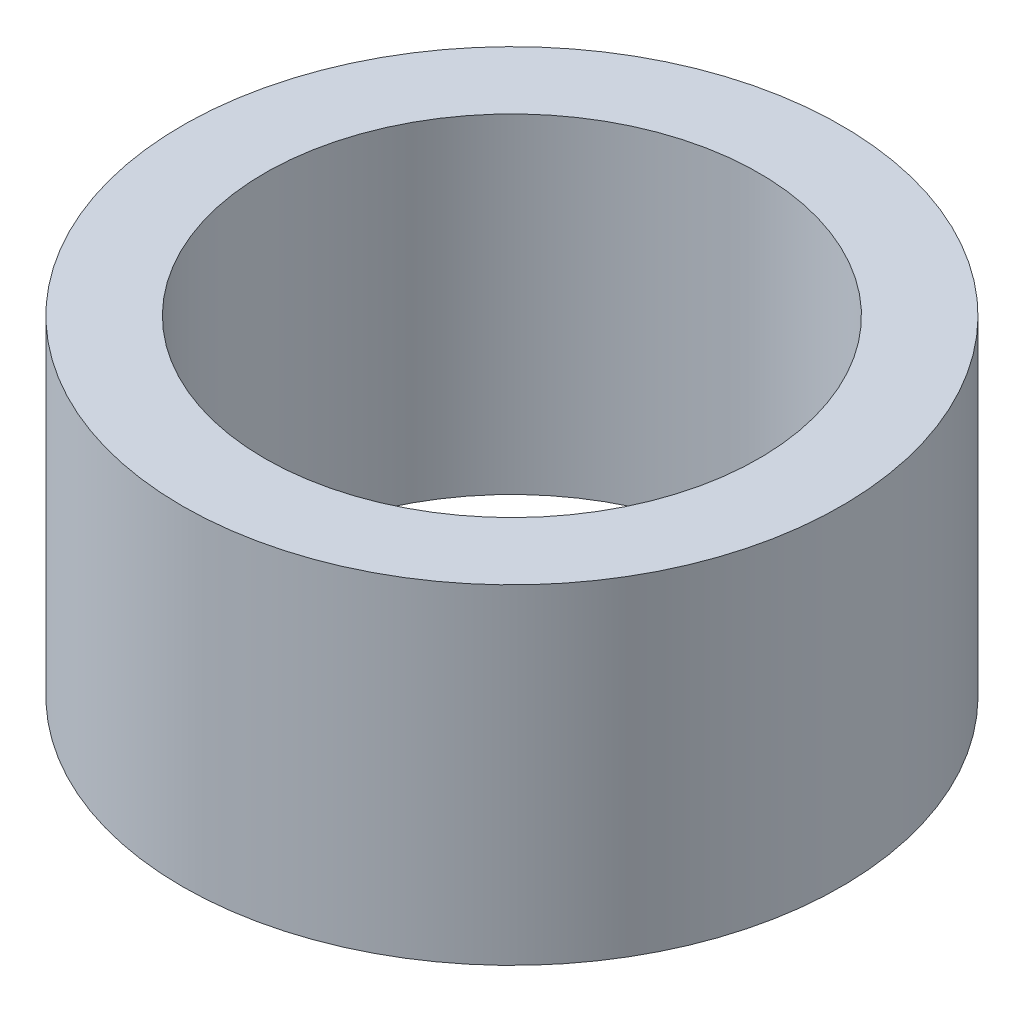
ISO-10303-21;
HEADER;
FILE_DESCRIPTION(('STEP AP214'),'2;1');
FILE_NAME('part.step','',(''),(''),'','','');
FILE_SCHEMA(('AUTOMOTIVE_DESIGN { 1 0 10303 214 1 1 1 1 }'));
ENDSEC;
DATA;
#1=APPLICATION_CONTEXT('core data for automotive mechanical design processes');
#2=APPLICATION_PROTOCOL_DEFINITION('international standard','automotive_design',2000,#1);
#3=PRODUCT_CONTEXT('',#1,'mechanical');
#4=PRODUCT('Part','Part','',(#3));
#5=PRODUCT_RELATED_PRODUCT_CATEGORY('part','',(#4));
#6=PRODUCT_DEFINITION_FORMATION('','',#4);
#7=PRODUCT_DEFINITION_CONTEXT('part definition',#1,'design');
#8=PRODUCT_DEFINITION('design','',#6,#7);
#9=PRODUCT_DEFINITION_SHAPE('','',#8);
#10=(LENGTH_UNIT() NAMED_UNIT(*) SI_UNIT(.MILLI.,.METRE.));
#11=(NAMED_UNIT(*) PLANE_ANGLE_UNIT() SI_UNIT($,.RADIAN.));
#12=(NAMED_UNIT(*) SI_UNIT($,.STERADIAN.) SOLID_ANGLE_UNIT());
#13=UNCERTAINTY_MEASURE_WITH_UNIT(LENGTH_MEASURE(1.E-05),#10,'distance_accuracy_value','');
#14=(GEOMETRIC_REPRESENTATION_CONTEXT(3) GLOBAL_UNCERTAINTY_ASSIGNED_CONTEXT((#13)) GLOBAL_UNIT_ASSIGNED_CONTEXT((#10,
#11,#12)) REPRESENTATION_CONTEXT('',''));
#15=CARTESIAN_POINT('',(0.,0.,0.));
#16=DIRECTION('',(0.,0.,1.));
#17=DIRECTION('',(1.,0.,0.));
#18=AXIS2_PLACEMENT_3D('',#15,#16,#17);
#19=CARTESIAN_POINT('',(0.,40.,0.));
#20=DIRECTION('',(0.,1.,0.));
#21=DIRECTION('',(0.,0.,1.));
#22=AXIS2_PLACEMENT_3D('',#19,#20,#21);
#23=PLANE('',#22);
#24=CARTESIAN_POINT('',(0.,40.,0.));
#25=DIRECTION('',(0.,1.,0.));
#26=DIRECTION('',(0.,0.,1.));
#27=AXIS2_PLACEMENT_3D('',#24,#25,#26);
#28=CIRCLE('',#27,40.);
#29=CARTESIAN_POINT('',(0.,40.,40.));
#30=VERTEX_POINT('',#29);
#31=EDGE_CURVE('E10',#30,#30,#28,.T.);
#32=ORIENTED_EDGE('',*,*,#31,.T.);
#33=EDGE_LOOP('',(#32));
#34=FACE_BOUND('',#33,.T.);
#35=CARTESIAN_POINT('',(0.,40.,0.));
#36=DIRECTION('',(0.,1.,0.));
#37=DIRECTION('',(0.,0.,1.));
#38=AXIS2_PLACEMENT_3D('',#35,#36,#37);
#39=CIRCLE('',#38,30.);
#40=CARTESIAN_POINT('',(0.,40.,30.));
#41=VERTEX_POINT('',#40);
#42=EDGE_CURVE('E47',#41,#41,#39,.T.);
#43=ORIENTED_EDGE('',*,*,#42,.F.);
#44=EDGE_LOOP('',(#43));
#45=FACE_BOUND('',#44,.T.);
#46=ADVANCED_FACE('F36',(#34,#45),#23,.T.);
#47=CARTESIAN_POINT('',(0.,0.,0.));
#48=DIRECTION('',(0.,1.,0.));
#49=DIRECTION('',(0.,0.,1.));
#50=AXIS2_PLACEMENT_3D('',#47,#48,#49);
#51=PLANE('',#50);
#52=CARTESIAN_POINT('',(0.,0.,0.));
#53=DIRECTION('',(0.,1.,0.));
#54=DIRECTION('',(0.,0.,1.));
#55=AXIS2_PLACEMENT_3D('',#52,#53,#54);
#56=CIRCLE('',#55,40.);
#57=CARTESIAN_POINT('',(0.,0.,40.));
#58=VERTEX_POINT('',#57);
#59=EDGE_CURVE('E40',#58,#58,#56,.T.);
#60=ORIENTED_EDGE('',*,*,#59,.F.);
#61=EDGE_LOOP('',(#60));
#62=FACE_BOUND('',#61,.T.);
#63=CARTESIAN_POINT('',(0.,0.,0.));
#64=DIRECTION('',(0.,1.,0.));
#65=DIRECTION('',(0.,0.,1.));
#66=AXIS2_PLACEMENT_3D('',#63,#64,#65);
#67=CIRCLE('',#66,30.);
#68=CARTESIAN_POINT('',(0.,0.,30.));
#69=VERTEX_POINT('',#68);
#70=EDGE_CURVE('E49',#69,#69,#67,.T.);
#71=ORIENTED_EDGE('',*,*,#70,.T.);
#72=EDGE_LOOP('',(#71));
#73=FACE_BOUND('',#72,.T.);
#74=ADVANCED_FACE('F59',(#62,#73),#51,.F.);
#75=CARTESIAN_POINT('',(0.,40.,0.));
#76=DIRECTION('',(0.,-1.,0.));
#77=DIRECTION('',(0.,0.,-1.));
#78=AXIS2_PLACEMENT_3D('',#75,#76,#77);
#79=CYLINDRICAL_SURFACE('',#78,40.);
#80=ORIENTED_EDGE('',*,*,#31,.F.);
#81=EDGE_LOOP('',(#80));
#82=FACE_BOUND('',#81,.T.);
#83=ORIENTED_EDGE('',*,*,#59,.T.);
#84=EDGE_LOOP('',(#83));
#85=FACE_BOUND('',#84,.T.);
#86=ADVANCED_FACE('F38',(#82,#85),#79,.T.);
#87=CARTESIAN_POINT('',(0.,40.,0.));
#88=DIRECTION('',(0.,-1.,0.));
#89=DIRECTION('',(0.,0.,-1.));
#90=AXIS2_PLACEMENT_3D('',#87,#88,#89);
#91=CYLINDRICAL_SURFACE('',#90,30.);
#92=ORIENTED_EDGE('',*,*,#42,.T.);
#93=EDGE_LOOP('',(#92));
#94=FACE_BOUND('',#93,.T.);
#95=ORIENTED_EDGE('',*,*,#70,.F.);
#96=EDGE_LOOP('',(#95));
#97=FACE_BOUND('',#96,.T.);
#98=ADVANCED_FACE('F55',(#94,#97),#91,.F.);
#99=CLOSED_SHELL('',(#46,#74,#86,#98));
#100=MANIFOLD_SOLID_BREP('B2',#99);
#101=ADVANCED_BREP_SHAPE_REPRESENTATION('',(#18,#100),#14);
#102=SHAPE_DEFINITION_REPRESENTATION(#9,#101);
ENDSEC;
END-ISO-10303-21;
